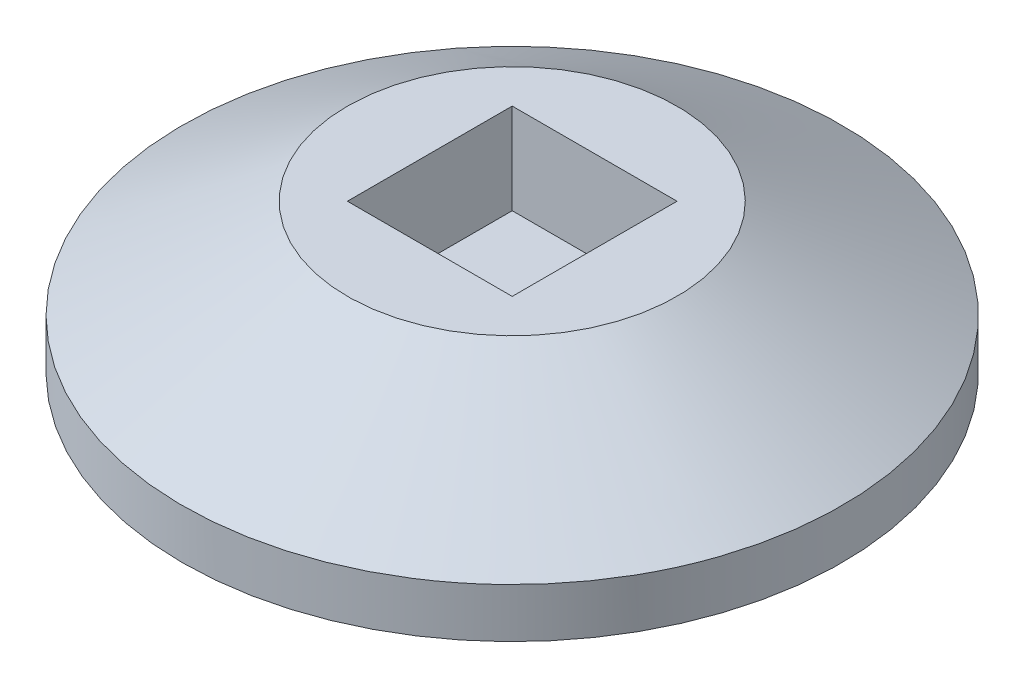
ISO-10303-21;
HEADER;
FILE_DESCRIPTION(('STEP AP214'),'2;1');
FILE_NAME('part.step','',(''),(''),'','','');
FILE_SCHEMA(('AUTOMOTIVE_DESIGN { 1 0 10303 214 1 1 1 1 }'));
ENDSEC;
DATA;
#1=APPLICATION_CONTEXT('core data for automotive mechanical design processes');
#2=APPLICATION_PROTOCOL_DEFINITION('international standard','automotive_design',2000,#1);
#3=PRODUCT_CONTEXT('',#1,'mechanical');
#4=PRODUCT('Part','Part','',(#3));
#5=PRODUCT_RELATED_PRODUCT_CATEGORY('part','',(#4));
#6=PRODUCT_DEFINITION_FORMATION('','',#4);
#7=PRODUCT_DEFINITION_CONTEXT('part definition',#1,'design');
#8=PRODUCT_DEFINITION('design','',#6,#7);
#9=PRODUCT_DEFINITION_SHAPE('','',#8);
#10=(LENGTH_UNIT() NAMED_UNIT(*) SI_UNIT(.MILLI.,.METRE.));
#11=(NAMED_UNIT(*) PLANE_ANGLE_UNIT() SI_UNIT($,.RADIAN.));
#12=(NAMED_UNIT(*) SI_UNIT($,.STERADIAN.) SOLID_ANGLE_UNIT());
#13=UNCERTAINTY_MEASURE_WITH_UNIT(LENGTH_MEASURE(1.E-05),#10,'distance_accuracy_value','');
#14=(GEOMETRIC_REPRESENTATION_CONTEXT(3) GLOBAL_UNCERTAINTY_ASSIGNED_CONTEXT((#13)) GLOBAL_UNIT_ASSIGNED_CONTEXT((#10,
#11,#12)) REPRESENTATION_CONTEXT('',''));
#15=CARTESIAN_POINT('',(0.,0.,0.));
#16=DIRECTION('',(0.,0.,1.));
#17=DIRECTION('',(1.,0.,0.));
#18=AXIS2_PLACEMENT_3D('',#15,#16,#17);
#19=CARTESIAN_POINT('',(0.,7.5,0.));
#20=DIRECTION('',(0.,1.,0.));
#21=DIRECTION('',(0.,0.,1.));
#22=AXIS2_PLACEMENT_3D('',#19,#20,#21);
#23=PLANE('',#22);
#24=CARTESIAN_POINT('',(0.,7.5,0.));
#25=DIRECTION('',(0.,1.,0.));
#26=DIRECTION('',(0.,0.,1.));
#27=AXIS2_PLACEMENT_3D('',#24,#25,#26);
#28=CIRCLE('',#27,10.);
#29=CARTESIAN_POINT('',(-6.42734128129152,7.5,-7.66089316292858));
#30=VERTEX_POINT('',#29);
#31=EDGE_CURVE('E135',#30,#30,#28,.T.);
#32=ORIENTED_EDGE('',*,*,#31,.T.);
#33=EDGE_LOOP('',(#32));
#34=FACE_BOUND('',#33,.T.);
#35=DIRECTION('',(0.,0.,1.));
#36=VECTOR('',#35,1.);
#37=CARTESIAN_POINT('',(-5.,7.5,-5.));
#38=LINE('',#37,#36);
#39=CARTESIAN_POINT('',(-5.,7.5,-5.));
#40=VERTEX_POINT('',#39);
#41=CARTESIAN_POINT('',(-5.,7.5,5.));
#42=VERTEX_POINT('',#41);
#43=EDGE_CURVE('E126',#40,#42,#38,.T.);
#44=ORIENTED_EDGE('',*,*,#43,.F.);
#45=DIRECTION('',(1.,0.,0.));
#46=VECTOR('',#45,1.);
#47=CARTESIAN_POINT('',(-5.,7.5,-5.));
#48=LINE('',#47,#46);
#49=CARTESIAN_POINT('',(5.,7.5,-5.));
#50=VERTEX_POINT('',#49);
#51=EDGE_CURVE('E62',#40,#50,#48,.T.);
#52=ORIENTED_EDGE('',*,*,#51,.T.);
#53=DIRECTION('',(0.,0.,1.));
#54=VECTOR('',#53,1.);
#55=CARTESIAN_POINT('',(5.,7.5,-5.));
#56=LINE('',#55,#54);
#57=CARTESIAN_POINT('',(5.,7.5,5.));
#58=VERTEX_POINT('',#57);
#59=EDGE_CURVE('E121',#50,#58,#56,.T.);
#60=ORIENTED_EDGE('',*,*,#59,.T.);
#61=DIRECTION('',(1.,0.,0.));
#62=VECTOR('',#61,1.);
#63=CARTESIAN_POINT('',(-5.,7.5,5.));
#64=LINE('',#63,#62);
#65=EDGE_CURVE('E106',#42,#58,#64,.T.);
#66=ORIENTED_EDGE('',*,*,#65,.F.);
#67=EDGE_LOOP('',(#44,#52,#60,#66));
#68=FACE_BOUND('',#67,.T.);
#69=ADVANCED_FACE('F45',(#34,#68),#23,.T.);
#70=CARTESIAN_POINT('',(0.,1.5,0.));
#71=DIRECTION('',(0.,-1.,0.));
#72=DIRECTION('',(0.,0.,-1.));
#73=AXIS2_PLACEMENT_3D('',#70,#71,#72);
#74=CYLINDRICAL_SURFACE('',#73,20.);
#75=CARTESIAN_POINT('',(0.,1.5,0.));
#76=DIRECTION('',(0.,-1.,0.));
#77=DIRECTION('',(0.,0.,-1.));
#78=AXIS2_PLACEMENT_3D('',#75,#76,#77);
#79=CIRCLE('',#78,20.);
#80=CARTESIAN_POINT('',(-15.7490334503237,1.5,-12.3275279509148));
#81=VERTEX_POINT('',#80);
#82=EDGE_CURVE('E12',#81,#81,#79,.F.);
#83=ORIENTED_EDGE('',*,*,#82,.F.);
#84=EDGE_LOOP('',(#83));
#85=FACE_BOUND('',#84,.T.);
#86=CARTESIAN_POINT('',(0.,-1.5,0.));
#87=DIRECTION('',(0.,1.,0.));
#88=DIRECTION('',(0.,0.,1.));
#89=AXIS2_PLACEMENT_3D('',#86,#87,#88);
#90=CIRCLE('',#89,20.);
#91=CARTESIAN_POINT('',(0.,-1.5,20.));
#92=VERTEX_POINT('',#91);
#93=EDGE_CURVE('E55',#92,#92,#90,.T.);
#94=ORIENTED_EDGE('',*,*,#93,.T.);
#95=EDGE_LOOP('',(#94));
#96=FACE_BOUND('',#95,.T.);
#97=ADVANCED_FACE('F47',(#85,#96),#74,.T.);
#98=CARTESIAN_POINT('',(0.,-1.5,0.));
#99=DIRECTION('',(0.,1.,0.));
#100=DIRECTION('',(0.,0.,1.));
#101=AXIS2_PLACEMENT_3D('',#98,#99,#100);
#102=PLANE('',#101);
#103=ORIENTED_EDGE('',*,*,#93,.F.);
#104=EDGE_LOOP('',(#103));
#105=FACE_BOUND('',#104,.T.);
#106=ADVANCED_FACE('F157',(#105),#102,.F.);
#107=CARTESIAN_POINT('',(-6.42734128129152,7.5,-7.66089316292858));
#108=CARTESIAN_POINT('',(-15.7490334503237,1.5,-12.3275279509148));
#109=CARTESIAN_POINT('',(8.89444504456563,7.5,-20.5155757255116));
#110=CARTESIAN_POINT('',(8.90602245150596,1.5,-43.8255948515622));
#111=CARTESIAN_POINT('',(21.7491276071487,7.5,-5.19378939965447));
#112=CARTESIAN_POINT('',(40.4040893521533,1.5,-19.1705389497325));
#113=CARTESIAN_POINT('',(6.42734128129152,7.5,7.66089316292858));
#114=CARTESIAN_POINT('',(15.7490334503237,1.5,12.3275279509148));
#115=CARTESIAN_POINT('',(-8.89444504456564,7.5,20.5155757255116));
#116=CARTESIAN_POINT('',(-8.90602245150595,1.5,43.8255948515622));
#117=CARTESIAN_POINT('',(-21.7491276071487,7.5,5.19378939965446));
#118=CARTESIAN_POINT('',(-40.4040893521533,1.5,19.1705389497325));
#119=CARTESIAN_POINT('',(-6.42734128129152,7.5,-7.66089316292858));
#120=CARTESIAN_POINT('',(-15.7490334503237,1.5,-12.3275279509148));
#121=(BOUNDED_SURFACE() B_SPLINE_SURFACE(3,1,((#107,#108),(#109,#110),(#111,#112),(#113,#114),
(#115,#116),(#117,#118),(#119,#120)),.UNSPECIFIED.,.T.,.F.,.F.) B_SPLINE_SURFACE_WITH_KNOTS((4,
3,4),(2,2),(0.,0.5,1.),(0.,1.),
.UNSPECIFIED.) GEOMETRIC_REPRESENTATION_ITEM() RATIONAL_B_SPLINE_SURFACE(((1.,1.),
(0.333333333333333,0.333333333333333),(0.333333333333333,0.333333333333333),(1.,1.),
(0.333333333333333,0.333333333333333),(0.333333333333333,0.333333333333333),(1.,1.))) REPRESENTATION_ITEM('') SURFACE());
#122=CARTESIAN_POINT('',(-6.42734128129152,7.5,-7.66089316292858));
#123=CARTESIAN_POINT('',(-6.52444224138561,7.4375,-7.7095039419701));
#124=CARTESIAN_POINT('',(-6.62154320147969,7.375,-7.75811472101163));
#125=CARTESIAN_POINT('',(-6.81574512166786,7.25,-7.85533627909467));
#126=CARTESIAN_POINT('',(-6.91284608176195,7.1875,-7.9039470581362));
#127=CARTESIAN_POINT('',(-7.10704800195012,7.0625,-8.00116861621924));
#128=CARTESIAN_POINT('',(-7.2041489620442,7.,-8.04977939526077));
#129=CARTESIAN_POINT('',(-7.39835088223237,6.875,-8.14700095334381));
#130=CARTESIAN_POINT('',(-7.49545184232646,6.8125,-8.19561173238533));
#131=CARTESIAN_POINT('',(-7.68965376251463,6.6875,-8.29283329046838));
#132=CARTESIAN_POINT('',(-7.78675472260871,6.625,-8.34144406950991));
#133=CARTESIAN_POINT('',(-7.98095664279688,6.5,-8.43866562759295));
#134=CARTESIAN_POINT('',(-8.07805760289097,6.4375,-8.48727640663448));
#135=CARTESIAN_POINT('',(-8.27225952307914,6.3125,-8.58449796471752));
#136=CARTESIAN_POINT('',(-8.36936048317322,6.25,-8.63310874375904));
#137=CARTESIAN_POINT('',(-8.56356240336139,6.125,-8.73033030184209));
#138=CARTESIAN_POINT('',(-8.66066336345548,6.0625,-8.77894108088362));
#139=CARTESIAN_POINT('',(-8.85486528364365,5.9375,-8.87616263896666));
#140=CARTESIAN_POINT('',(-8.95196624373773,5.875,-8.92477341800819));
#141=CARTESIAN_POINT('',(-9.1461681639259,5.75,-9.02199497609123));
#142=CARTESIAN_POINT('',(-9.24326912401999,5.6875,-9.07060575513276));
#143=CARTESIAN_POINT('',(-9.43747104420816,5.5625,-9.1678273132158));
#144=CARTESIAN_POINT('',(-9.53457200430224,5.5,-9.21643809225733));
#145=CARTESIAN_POINT('',(-9.72877392449041,5.375,-9.31365965034037));
#146=CARTESIAN_POINT('',(-9.82587488458449,5.3125,-9.3622704293819));
#147=CARTESIAN_POINT('',(-10.0200768047727,5.1875,-9.45949198746494));
#148=CARTESIAN_POINT('',(-10.1171777648667,5.125,-9.50810276650646));
#149=CARTESIAN_POINT('',(-10.3113796850549,5.,-9.60532432458951));
#150=CARTESIAN_POINT('',(-10.408480645149,4.9375,-9.65393510363104));
#151=CARTESIAN_POINT('',(-10.6026825653372,4.8125,-9.75115666171408));
#152=CARTESIAN_POINT('',(-10.6997835254313,4.75,-9.79976744075561));
#153=CARTESIAN_POINT('',(-10.8939854456194,4.625,-9.89698899883865));
#154=CARTESIAN_POINT('',(-10.9910864057135,4.5625,-9.94559977788017));
#155=CARTESIAN_POINT('',(-11.1852883259017,4.4375,-10.0428213359632));
#156=CARTESIAN_POINT('',(-11.2823892859958,4.375,-10.0914321150047));
#157=CARTESIAN_POINT('',(-11.4765912061839,4.25,-10.1886536730878));
#158=CARTESIAN_POINT('',(-11.573692166278,4.1875,-10.2372644521293));
#159=CARTESIAN_POINT('',(-11.7678940864662,4.0625,-10.3344860102124));
#160=CARTESIAN_POINT('',(-11.8649950465603,4.,-10.3830967892539));
#161=CARTESIAN_POINT('',(-12.0591969667484,3.875,-10.4803183473369));
#162=CARTESIAN_POINT('',(-12.1562979268425,3.8125,-10.5289291263785));
#163=CARTESIAN_POINT('',(-12.3504998470307,3.6875,-10.6261506844615));
#164=CARTESIAN_POINT('',(-12.4476008071248,3.625,-10.674761463503));
#165=CARTESIAN_POINT('',(-12.641802727313,3.5,-10.7719830215861));
#166=CARTESIAN_POINT('',(-12.738903687407,3.4375,-10.8205938006276));
#167=CARTESIAN_POINT('',(-12.9331056075952,3.3125,-10.9178153587106));
#168=CARTESIAN_POINT('',(-13.0302065676893,3.25,-10.9664261377522));
#169=CARTESIAN_POINT('',(-13.2244084878775,3.125,-11.0636476958352));
#170=CARTESIAN_POINT('',(-13.3215094479715,3.0625,-11.1122584748767));
#171=CARTESIAN_POINT('',(-13.5157113681597,2.9375,-11.2094800329598));
#172=CARTESIAN_POINT('',(-13.6128123282538,2.875,-11.2580908120013));
#173=CARTESIAN_POINT('',(-13.807014248442,2.75,-11.3553123700844));
#174=CARTESIAN_POINT('',(-13.9041152085361,2.6875,-11.4039231491259));
#175=CARTESIAN_POINT('',(-14.0983171287242,2.5625,-11.5011447072089));
#176=CARTESIAN_POINT('',(-14.1954180888183,2.5,-11.5497554862504));
#177=CARTESIAN_POINT('',(-14.3896200090065,2.375,-11.6469770443335));
#178=CARTESIAN_POINT('',(-14.4867209691006,2.3125,-11.695587823375));
#179=CARTESIAN_POINT('',(-14.6809228892887,2.1875,-11.7928093814581));
#180=CARTESIAN_POINT('',(-14.7780238493828,2.125,-11.8414201604996));
#181=CARTESIAN_POINT('',(-14.972225769571,2.,-11.9386417185826));
#182=CARTESIAN_POINT('',(-15.0693267296651,1.9375,-11.9872524976242));
#183=CARTESIAN_POINT('',(-15.2635286498532,1.8125,-12.0844740557072));
#184=CARTESIAN_POINT('',(-15.3606296099473,1.75,-12.1330848347487));
#185=CARTESIAN_POINT('',(-15.5548315301355,1.625,-12.2303063928318));
#186=CARTESIAN_POINT('',(-15.6519324902296,1.5625,-12.2789171718733));
#187=CARTESIAN_POINT('',(-15.7490334503237,1.5,-12.3275279509148));
#188=B_SPLINE_CURVE_WITH_KNOTS('',3,(#122,#123,#124,#125,#126,#127,#128,#129,#130,#131,#132,
#133,#134,#135,#136,#137,#138,#139,#140,#141,#142,#143,#144,#145,#146,#147,#148,#149,#150,#151,
#152,#153,#154,#155,#156,#157,#158,#159,#160,#161,#162,#163,#164,#165,#166,#167,#168,#169,#170,
#171,#172,#173,#174,#175,#176,#177,#178,#179,#180,#181,#182,#183,#184,#185,#186,#187),
.UNSPECIFIED.,.F.,.F.,(4,2,2,2,2,2,2,2,2,2,2,2,2,2,2,2,2,2,2,2,2,2,2,2,2,2,2,2,2,2,2,2,4),(0.,
0.375873234763998,0.751746469527997,1.127619704292,1.50349293905599,1.87936617381999,
2.25523940858399,2.63111264334799,3.00698587811199,3.38285911287598,3.75873234763998,
4.13460558240398,4.51047881716798,4.88635205193198,5.26222528669598,5.63809852145997,
6.01397175622397,6.38984499098797,6.76571822575197,7.14159146051597,7.51746469527997,
7.89333793004396,8.26921116480796,8.64508439957196,9.02095763433596,9.39683086909996,
9.77270410386396,10.148577338628,10.524450573392,10.900323808156,11.27619704292,
11.6520702776839,12.0279435124479),.UNSPECIFIED.);
#189=EDGE_CURVE('BSEAM145',#30,#81,#188,.T.);
#190=ORIENTED_EDGE('',*,*,#31,.F.);
#191=ORIENTED_EDGE('',*,*,#82,.T.);
#192=ORIENTED_EDGE('',*,*,#189,.T.);
#193=ORIENTED_EDGE('',*,*,#189,.F.);
#194=EDGE_LOOP('',(#190,#192,#191,#193));
#195=FACE_BOUND('',#194,.T.);
#196=ADVANCED_FACE('F145',(#195),#121,.T.);
#197=CARTESIAN_POINT('',(-5.,2.,-5.));
#198=DIRECTION('',(0.,0.,1.));
#199=DIRECTION('',(1.,0.,0.));
#200=AXIS2_PLACEMENT_3D('',#197,#198,#199);
#201=PLANE('',#200);
#202=ORIENTED_EDGE('',*,*,#51,.F.);
#203=DIRECTION('',(0.,1.,0.));
#204=VECTOR('',#203,1.);
#205=CARTESIAN_POINT('',(-5.,2.,-5.));
#206=LINE('',#205,#204);
#207=CARTESIAN_POINT('',(-5.,2.,-5.));
#208=VERTEX_POINT('',#207);
#209=EDGE_CURVE('E67',#208,#40,#206,.T.);
#210=ORIENTED_EDGE('',*,*,#209,.F.);
#211=DIRECTION('',(1.,0.,0.));
#212=VECTOR('',#211,1.);
#213=CARTESIAN_POINT('',(-5.,2.,-5.));
#214=LINE('',#213,#212);
#215=CARTESIAN_POINT('',(5.,2.,-5.));
#216=VERTEX_POINT('',#215);
#217=EDGE_CURVE('E101',#208,#216,#214,.T.);
#218=ORIENTED_EDGE('',*,*,#217,.T.);
#219=DIRECTION('',(0.,1.,0.));
#220=VECTOR('',#219,1.);
#221=CARTESIAN_POINT('',(5.,2.,-5.));
#222=LINE('',#221,#220);
#223=EDGE_CURVE('E98',#216,#50,#222,.T.);
#224=ORIENTED_EDGE('',*,*,#223,.T.);
#225=EDGE_LOOP('',(#202,#210,#218,#224));
#226=FACE_BOUND('',#225,.T.);
#227=ADVANCED_FACE('F156',(#226),#201,.T.);
#228=CARTESIAN_POINT('',(5.,2.,-5.));
#229=DIRECTION('',(-1.,0.,0.));
#230=DIRECTION('',(0.,0.,1.));
#231=AXIS2_PLACEMENT_3D('',#228,#229,#230);
#232=PLANE('',#231);
#233=ORIENTED_EDGE('',*,*,#59,.F.);
#234=ORIENTED_EDGE('',*,*,#223,.F.);
#235=DIRECTION('',(0.,0.,1.));
#236=VECTOR('',#235,1.);
#237=CARTESIAN_POINT('',(5.,2.,-5.));
#238=LINE('',#237,#236);
#239=CARTESIAN_POINT('',(5.,2.,5.));
#240=VERTEX_POINT('',#239);
#241=EDGE_CURVE('E92',#216,#240,#238,.T.);
#242=ORIENTED_EDGE('',*,*,#241,.T.);
#243=DIRECTION('',(0.,1.,0.));
#244=VECTOR('',#243,1.);
#245=CARTESIAN_POINT('',(5.,2.,5.));
#246=LINE('',#245,#244);
#247=EDGE_CURVE('E97',#240,#58,#246,.T.);
#248=ORIENTED_EDGE('',*,*,#247,.T.);
#249=EDGE_LOOP('',(#233,#234,#242,#248));
#250=FACE_BOUND('',#249,.T.);
#251=ADVANCED_FACE('F96',(#250),#232,.T.);
#252=CARTESIAN_POINT('',(-5.,2.,5.));
#253=DIRECTION('',(0.,0.,1.));
#254=DIRECTION('',(1.,0.,0.));
#255=AXIS2_PLACEMENT_3D('',#252,#253,#254);
#256=PLANE('',#255);
#257=ORIENTED_EDGE('',*,*,#65,.T.);
#258=ORIENTED_EDGE('',*,*,#247,.F.);
#259=DIRECTION('',(1.,0.,0.));
#260=VECTOR('',#259,1.);
#261=CARTESIAN_POINT('',(-5.,2.,5.));
#262=LINE('',#261,#260);
#263=CARTESIAN_POINT('',(-5.,2.,5.));
#264=VERTEX_POINT('',#263);
#265=EDGE_CURVE('E100',#264,#240,#262,.T.);
#266=ORIENTED_EDGE('',*,*,#265,.F.);
#267=DIRECTION('',(0.,1.,0.));
#268=VECTOR('',#267,1.);
#269=CARTESIAN_POINT('',(-5.,2.,5.));
#270=LINE('',#269,#268);
#271=EDGE_CURVE('E85',#264,#42,#270,.T.);
#272=ORIENTED_EDGE('',*,*,#271,.T.);
#273=EDGE_LOOP('',(#257,#258,#266,#272));
#274=FACE_BOUND('',#273,.T.);
#275=ADVANCED_FACE('F103',(#274),#256,.F.);
#276=CARTESIAN_POINT('',(-5.,2.,-5.));
#277=DIRECTION('',(-1.,0.,0.));
#278=DIRECTION('',(0.,0.,1.));
#279=AXIS2_PLACEMENT_3D('',#276,#277,#278);
#280=PLANE('',#279);
#281=ORIENTED_EDGE('',*,*,#43,.T.);
#282=ORIENTED_EDGE('',*,*,#271,.F.);
#283=DIRECTION('',(0.,0.,1.));
#284=VECTOR('',#283,1.);
#285=CARTESIAN_POINT('',(-5.,2.,-5.));
#286=LINE('',#285,#284);
#287=EDGE_CURVE('E112',#208,#264,#286,.T.);
#288=ORIENTED_EDGE('',*,*,#287,.F.);
#289=ORIENTED_EDGE('',*,*,#209,.T.);
#290=EDGE_LOOP('',(#281,#282,#288,#289));
#291=FACE_BOUND('',#290,.T.);
#292=ADVANCED_FACE('F179',(#291),#280,.F.);
#293=CARTESIAN_POINT('',(0.,2.,0.));
#294=DIRECTION('',(0.,-1.,0.));
#295=DIRECTION('',(0.,0.,-1.));
#296=AXIS2_PLACEMENT_3D('',#293,#294,#295);
#297=PLANE('',#296);
#298=ORIENTED_EDGE('',*,*,#217,.F.);
#299=ORIENTED_EDGE('',*,*,#287,.T.);
#300=ORIENTED_EDGE('',*,*,#265,.T.);
#301=ORIENTED_EDGE('',*,*,#241,.F.);
#302=EDGE_LOOP('',(#298,#299,#300,#301));
#303=FACE_BOUND('',#302,.T.);
#304=ADVANCED_FACE('F110',(#303),#297,.F.);
#305=CLOSED_SHELL('',(#69,#97,#106,#196,#227,#251,#275,#292,#304));
#306=MANIFOLD_SOLID_BREP('B2',#305);
#307=ADVANCED_BREP_SHAPE_REPRESENTATION('',(#18,#306),#14);
#308=SHAPE_DEFINITION_REPRESENTATION(#9,#307);
ENDSEC;
END-ISO-10303-21;
